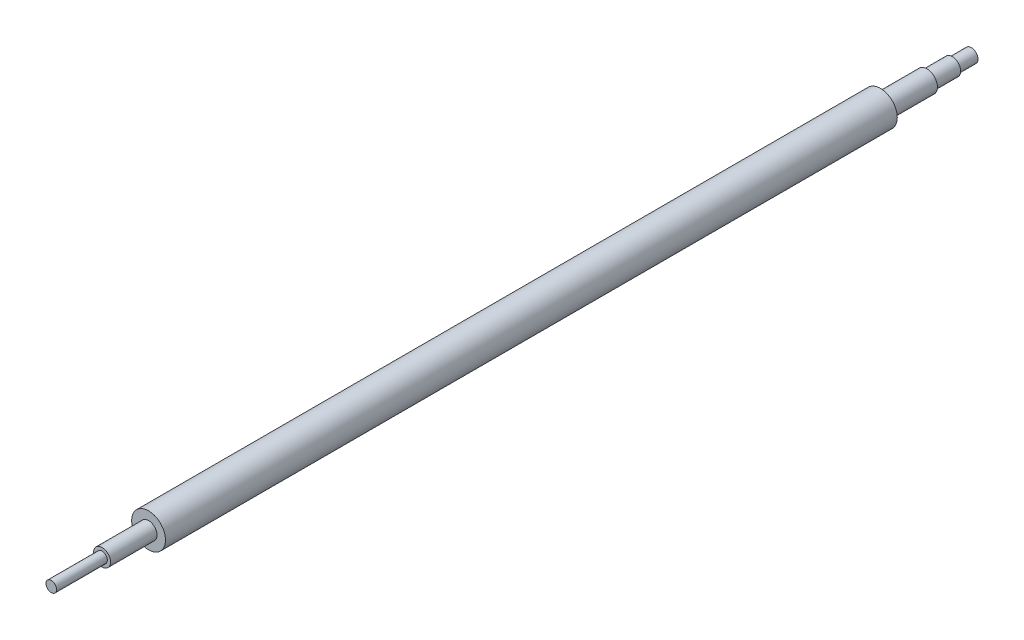
ISO-10303-21;
HEADER;
FILE_DESCRIPTION(('STEP AP214'),'2;1');
FILE_NAME('part.step','',(''),(''),'','','');
FILE_SCHEMA(('AUTOMOTIVE_DESIGN { 1 0 10303 214 1 1 1 1 }'));
ENDSEC;
DATA;
#1=APPLICATION_CONTEXT('core data for automotive mechanical design processes');
#2=APPLICATION_PROTOCOL_DEFINITION('international standard','automotive_design',2000,#1);
#3=PRODUCT_CONTEXT('',#1,'mechanical');
#4=PRODUCT('Part','Part','',(#3));
#5=PRODUCT_RELATED_PRODUCT_CATEGORY('part','',(#4));
#6=PRODUCT_DEFINITION_FORMATION('','',#4);
#7=PRODUCT_DEFINITION_CONTEXT('part definition',#1,'design');
#8=PRODUCT_DEFINITION('design','',#6,#7);
#9=PRODUCT_DEFINITION_SHAPE('','',#8);
#10=(LENGTH_UNIT() NAMED_UNIT(*) SI_UNIT(.MILLI.,.METRE.));
#11=(NAMED_UNIT(*) PLANE_ANGLE_UNIT() SI_UNIT($,.RADIAN.));
#12=(NAMED_UNIT(*) SI_UNIT($,.STERADIAN.) SOLID_ANGLE_UNIT());
#13=UNCERTAINTY_MEASURE_WITH_UNIT(LENGTH_MEASURE(1.E-05),#10,'distance_accuracy_value','');
#14=(GEOMETRIC_REPRESENTATION_CONTEXT(3) GLOBAL_UNCERTAINTY_ASSIGNED_CONTEXT((#13)) GLOBAL_UNIT_ASSIGNED_CONTEXT((#10,
#11,#12)) REPRESENTATION_CONTEXT('',''));
#15=CARTESIAN_POINT('',(0.,0.,0.));
#16=DIRECTION('',(0.,0.,1.));
#17=DIRECTION('',(1.,0.,0.));
#18=AXIS2_PLACEMENT_3D('',#15,#16,#17);
#19=CARTESIAN_POINT('',(0.,0.,392.));
#20=DIRECTION('',(0.,0.,-1.));
#21=DIRECTION('',(-1.,0.,0.));
#22=AXIS2_PLACEMENT_3D('',#19,#20,#21);
#23=CYLINDRICAL_SURFACE('',#22,2.5);
#24=CARTESIAN_POINT('',(0.,0.,392.));
#25=DIRECTION('',(0.,0.,1.));
#26=DIRECTION('',(1.,0.,0.));
#27=AXIS2_PLACEMENT_3D('',#24,#25,#26);
#28=CIRCLE('',#27,2.5);
#29=CARTESIAN_POINT('',(2.5,0.,392.));
#30=VERTEX_POINT('',#29);
#31=EDGE_CURVE('E11',#30,#30,#28,.T.);
#32=ORIENTED_EDGE('',*,*,#31,.F.);
#33=EDGE_LOOP('',(#32));
#34=FACE_BOUND('',#33,.T.);
#35=CARTESIAN_POINT('',(0.,0.,368.));
#36=DIRECTION('',(0.,0.,1.));
#37=DIRECTION('',(1.,0.,0.));
#38=AXIS2_PLACEMENT_3D('',#35,#36,#37);
#39=CIRCLE('',#38,2.5);
#40=CARTESIAN_POINT('',(2.5,0.,368.));
#41=VERTEX_POINT('',#40);
#42=EDGE_CURVE('E43',#41,#41,#39,.T.);
#43=ORIENTED_EDGE('',*,*,#42,.T.);
#44=EDGE_LOOP('',(#43));
#45=FACE_BOUND('',#44,.T.);
#46=ADVANCED_FACE('F40',(#34,#45),#23,.T.);
#47=CARTESIAN_POINT('',(0.,0.,392.));
#48=DIRECTION('',(0.,0.,1.));
#49=DIRECTION('',(1.,0.,0.));
#50=AXIS2_PLACEMENT_3D('',#47,#48,#49);
#51=PLANE('',#50);
#52=ORIENTED_EDGE('',*,*,#31,.T.);
#53=EDGE_LOOP('',(#52));
#54=FACE_BOUND('',#53,.T.);
#55=ADVANCED_FACE('F55',(#54),#51,.T.);
#56=CARTESIAN_POINT('',(0.,0.,368.));
#57=DIRECTION('',(0.,0.,1.));
#58=DIRECTION('',(1.,0.,0.));
#59=AXIS2_PLACEMENT_3D('',#56,#57,#58);
#60=PLANE('',#59);
#61=ORIENTED_EDGE('',*,*,#42,.F.);
#62=EDGE_LOOP('',(#61));
#63=FACE_BOUND('',#62,.T.);
#64=ADVANCED_FACE('F53',(#63),#60,.F.);
#65=CLOSED_SHELL('',(#46,#55,#64));
#66=MANIFOLD_SOLID_BREP('B2',#65);
#67=CARTESIAN_POINT('',(0.,0.,-34.));
#68=DIRECTION('',(0.,0.,-1.));
#69=DIRECTION('',(-1.,0.,0.));
#70=AXIS2_PLACEMENT_3D('',#67,#68,#69);
#71=PLANE('',#70);
#72=CARTESIAN_POINT('',(0.,0.,-34.));
#73=DIRECTION('',(0.,0.,-1.));
#74=DIRECTION('',(-1.,0.,0.));
#75=AXIS2_PLACEMENT_3D('',#72,#73,#74);
#76=CIRCLE('',#75,4.);
#77=CARTESIAN_POINT('',(-4.,0.,-34.));
#78=VERTEX_POINT('',#77);
#79=EDGE_CURVE('E100',#78,#78,#76,.T.);
#80=ORIENTED_EDGE('',*,*,#79,.T.);
#81=EDGE_LOOP('',(#80));
#82=FACE_BOUND('',#81,.T.);
#83=CARTESIAN_POINT('',(0.,0.,-34.));
#84=DIRECTION('',(0.,0.,-1.));
#85=DIRECTION('',(-1.,0.,0.));
#86=AXIS2_PLACEMENT_3D('',#83,#84,#85);
#87=CIRCLE('',#86,3.175);
#88=CARTESIAN_POINT('',(-3.175,0.,-34.));
#89=VERTEX_POINT('',#88);
#90=EDGE_CURVE('E108',#89,#89,#87,.T.);
#91=ORIENTED_EDGE('',*,*,#90,.F.);
#92=EDGE_LOOP('',(#91));
#93=FACE_BOUND('',#92,.T.);
#94=ADVANCED_FACE('F89',(#82,#93),#71,.T.);
#95=CARTESIAN_POINT('',(0.,0.,-22.));
#96=DIRECTION('',(0.,0.,-1.));
#97=DIRECTION('',(-1.,0.,0.));
#98=AXIS2_PLACEMENT_3D('',#95,#96,#97);
#99=PLANE('',#98);
#100=CARTESIAN_POINT('',(0.,0.,-22.));
#101=DIRECTION('',(0.,0.,-1.));
#102=DIRECTION('',(-1.,0.,0.));
#103=AXIS2_PLACEMENT_3D('',#100,#101,#102);
#104=CIRCLE('',#103,5.);
#105=CARTESIAN_POINT('',(-5.,0.,-22.));
#106=VERTEX_POINT('',#105);
#107=EDGE_CURVE('E39',#106,#106,#104,.T.);
#108=ORIENTED_EDGE('',*,*,#107,.T.);
#109=EDGE_LOOP('',(#108));
#110=FACE_BOUND('',#109,.T.);
#111=CARTESIAN_POINT('',(0.,0.,-22.));
#112=DIRECTION('',(0.,0.,-1.));
#113=DIRECTION('',(-1.,0.,0.));
#114=AXIS2_PLACEMENT_3D('',#111,#112,#113);
#115=CIRCLE('',#114,4.);
#116=CARTESIAN_POINT('',(-4.,0.,-22.));
#117=VERTEX_POINT('',#116);
#118=EDGE_CURVE('E102',#117,#117,#115,.T.);
#119=ORIENTED_EDGE('',*,*,#118,.F.);
#120=EDGE_LOOP('',(#119));
#121=FACE_BOUND('',#120,.T.);
#122=ADVANCED_FACE('F124',(#110,#121),#99,.T.);
#123=CARTESIAN_POINT('',(0.,0.,-22.));
#124=DIRECTION('',(0.,0.,1.));
#125=DIRECTION('',(1.,0.,0.));
#126=AXIS2_PLACEMENT_3D('',#123,#124,#125);
#127=CYLINDRICAL_SURFACE('',#126,5.);
#128=ORIENTED_EDGE('',*,*,#107,.F.);
#129=EDGE_LOOP('',(#128));
#130=FACE_BOUND('',#129,.T.);
#131=CARTESIAN_POINT('',(0.,0.,0.));
#132=DIRECTION('',(0.,0.,-1.));
#133=DIRECTION('',(-1.,0.,0.));
#134=AXIS2_PLACEMENT_3D('',#131,#132,#133);
#135=CIRCLE('',#134,5.);
#136=CARTESIAN_POINT('',(-5.,0.,0.));
#137=VERTEX_POINT('',#136);
#138=EDGE_CURVE('E93',#137,#137,#135,.T.);
#139=ORIENTED_EDGE('',*,*,#138,.T.);
#140=EDGE_LOOP('',(#139));
#141=FACE_BOUND('',#140,.T.);
#142=ADVANCED_FACE('F91',(#130,#141),#127,.T.);
#143=CARTESIAN_POINT('',(0.,0.,0.));
#144=DIRECTION('',(0.,0.,-1.));
#145=DIRECTION('',(-1.,0.,0.));
#146=AXIS2_PLACEMENT_3D('',#143,#144,#145);
#147=PLANE('',#146);
#148=ORIENTED_EDGE('',*,*,#138,.F.);
#149=EDGE_LOOP('',(#148));
#150=FACE_BOUND('',#149,.T.);
#151=ADVANCED_FACE('F134',(#150),#147,.F.);
#152=CARTESIAN_POINT('',(0.,0.,-34.));
#153=DIRECTION('',(0.,0.,1.));
#154=DIRECTION('',(1.,0.,0.));
#155=AXIS2_PLACEMENT_3D('',#152,#153,#154);
#156=CYLINDRICAL_SURFACE('',#155,4.);
#157=ORIENTED_EDGE('',*,*,#79,.F.);
#158=EDGE_LOOP('',(#157));
#159=FACE_BOUND('',#158,.T.);
#160=ORIENTED_EDGE('',*,*,#118,.T.);
#161=EDGE_LOOP('',(#160));
#162=FACE_BOUND('',#161,.T.);
#163=ADVANCED_FACE('F119',(#159,#162),#156,.T.);
#164=CARTESIAN_POINT('',(0.,0.,-43.));
#165=DIRECTION('',(0.,0.,1.));
#166=DIRECTION('',(1.,0.,0.));
#167=AXIS2_PLACEMENT_3D('',#164,#165,#166);
#168=CYLINDRICAL_SURFACE('',#167,3.175);
#169=CARTESIAN_POINT('',(0.,0.,-43.));
#170=DIRECTION('',(0.,0.,-1.));
#171=DIRECTION('',(-1.,0.,0.));
#172=AXIS2_PLACEMENT_3D('',#169,#170,#171);
#173=CIRCLE('',#172,3.175);
#174=CARTESIAN_POINT('',(-3.175,0.,-43.));
#175=VERTEX_POINT('',#174);
#176=EDGE_CURVE('E105',#175,#175,#173,.T.);
#177=ORIENTED_EDGE('',*,*,#176,.F.);
#178=EDGE_LOOP('',(#177));
#179=FACE_BOUND('',#178,.T.);
#180=ORIENTED_EDGE('',*,*,#90,.T.);
#181=EDGE_LOOP('',(#180));
#182=FACE_BOUND('',#181,.T.);
#183=ADVANCED_FACE('F116',(#179,#182),#168,.T.);
#184=CARTESIAN_POINT('',(0.,0.,-43.));
#185=DIRECTION('',(0.,0.,-1.));
#186=DIRECTION('',(-1.,0.,0.));
#187=AXIS2_PLACEMENT_3D('',#184,#185,#186);
#188=PLANE('',#187);
#189=ORIENTED_EDGE('',*,*,#176,.T.);
#190=EDGE_LOOP('',(#189));
#191=FACE_BOUND('',#190,.T.);
#192=ADVANCED_FACE('F114',(#191),#188,.T.);
#193=CLOSED_SHELL('',(#94,#122,#142,#151,#163,#183,#192));
#194=MANIFOLD_SOLID_BREP('B6',#193);
#195=CARTESIAN_POINT('',(0.,0.,368.));
#196=DIRECTION('',(0.,0.,-1.));
#197=DIRECTION('',(-1.,0.,0.));
#198=AXIS2_PLACEMENT_3D('',#195,#196,#197);
#199=CYLINDRICAL_SURFACE('',#198,4.);
#200=CARTESIAN_POINT('',(0.,0.,368.));
#201=DIRECTION('',(0.,0.,1.));
#202=DIRECTION('',(1.,0.,0.));
#203=AXIS2_PLACEMENT_3D('',#200,#201,#202);
#204=CIRCLE('',#203,4.);
#205=CARTESIAN_POINT('',(4.,0.,368.));
#206=VERTEX_POINT('',#205);
#207=EDGE_CURVE('E88',#206,#206,#204,.T.);
#208=ORIENTED_EDGE('',*,*,#207,.F.);
#209=EDGE_LOOP('',(#208));
#210=FACE_BOUND('',#209,.T.);
#211=CARTESIAN_POINT('',(0.,0.,346.));
#212=DIRECTION('',(0.,0.,1.));
#213=DIRECTION('',(1.,0.,0.));
#214=AXIS2_PLACEMENT_3D('',#211,#212,#213);
#215=CIRCLE('',#214,4.);
#216=CARTESIAN_POINT('',(4.,0.,346.));
#217=VERTEX_POINT('',#216);
#218=EDGE_CURVE('E200',#217,#217,#215,.T.);
#219=ORIENTED_EDGE('',*,*,#218,.T.);
#220=EDGE_LOOP('',(#219));
#221=FACE_BOUND('',#220,.T.);
#222=ADVANCED_FACE('F197',(#210,#221),#199,.T.);
#223=CARTESIAN_POINT('',(0.,0.,368.));
#224=DIRECTION('',(0.,0.,1.));
#225=DIRECTION('',(1.,0.,0.));
#226=AXIS2_PLACEMENT_3D('',#223,#224,#225);
#227=PLANE('',#226);
#228=ORIENTED_EDGE('',*,*,#207,.T.);
#229=EDGE_LOOP('',(#228));
#230=FACE_BOUND('',#229,.T.);
#231=ADVANCED_FACE('F212',(#230),#227,.T.);
#232=CARTESIAN_POINT('',(0.,0.,346.));
#233=DIRECTION('',(0.,0.,1.));
#234=DIRECTION('',(1.,0.,0.));
#235=AXIS2_PLACEMENT_3D('',#232,#233,#234);
#236=PLANE('',#235);
#237=ORIENTED_EDGE('',*,*,#218,.F.);
#238=EDGE_LOOP('',(#237));
#239=FACE_BOUND('',#238,.T.);
#240=ADVANCED_FACE('F210',(#239),#236,.F.);
#241=CLOSED_SHELL('',(#222,#231,#240));
#242=MANIFOLD_SOLID_BREP('B34',#241);
#243=CARTESIAN_POINT('',(0.,0.,346.));
#244=DIRECTION('',(0.,0.,-1.));
#245=DIRECTION('',(-1.,0.,0.));
#246=AXIS2_PLACEMENT_3D('',#243,#244,#245);
#247=CYLINDRICAL_SURFACE('',#246,8.);
#248=CARTESIAN_POINT('',(0.,0.,346.));
#249=DIRECTION('',(0.,0.,1.));
#250=DIRECTION('',(1.,0.,0.));
#251=AXIS2_PLACEMENT_3D('',#248,#249,#250);
#252=CIRCLE('',#251,8.);
#253=CARTESIAN_POINT('',(8.,0.,346.));
#254=VERTEX_POINT('',#253);
#255=EDGE_CURVE('E196',#254,#254,#252,.T.);
#256=ORIENTED_EDGE('',*,*,#255,.F.);
#257=EDGE_LOOP('',(#256));
#258=FACE_BOUND('',#257,.T.);
#259=CARTESIAN_POINT('',(0.,0.,0.));
#260=DIRECTION('',(0.,0.,1.));
#261=DIRECTION('',(1.,0.,0.));
#262=AXIS2_PLACEMENT_3D('',#259,#260,#261);
#263=CIRCLE('',#262,8.);
#264=CARTESIAN_POINT('',(8.,0.,0.));
#265=VERTEX_POINT('',#264);
#266=EDGE_CURVE('E241',#265,#265,#263,.T.);
#267=ORIENTED_EDGE('',*,*,#266,.T.);
#268=EDGE_LOOP('',(#267));
#269=FACE_BOUND('',#268,.T.);
#270=ADVANCED_FACE('F238',(#258,#269),#247,.T.);
#271=CARTESIAN_POINT('',(0.,0.,346.));
#272=DIRECTION('',(0.,0.,1.));
#273=DIRECTION('',(1.,0.,0.));
#274=AXIS2_PLACEMENT_3D('',#271,#272,#273);
#275=PLANE('',#274);
#276=ORIENTED_EDGE('',*,*,#255,.T.);
#277=EDGE_LOOP('',(#276));
#278=FACE_BOUND('',#277,.T.);
#279=ADVANCED_FACE('F253',(#278),#275,.T.);
#280=CARTESIAN_POINT('',(0.,0.,0.));
#281=DIRECTION('',(0.,0.,1.));
#282=DIRECTION('',(1.,0.,0.));
#283=AXIS2_PLACEMENT_3D('',#280,#281,#282);
#284=PLANE('',#283);
#285=ORIENTED_EDGE('',*,*,#266,.F.);
#286=EDGE_LOOP('',(#285));
#287=FACE_BOUND('',#286,.T.);
#288=ADVANCED_FACE('F251',(#287),#284,.F.);
#289=CLOSED_SHELL('',(#270,#279,#288));
#290=MANIFOLD_SOLID_BREP('B83',#289);
#291=ADVANCED_BREP_SHAPE_REPRESENTATION('',(#18,#66,#194,#242,#290),#14);
#292=SHAPE_DEFINITION_REPRESENTATION(#9,#291);
ENDSEC;
END-ISO-10303-21;
